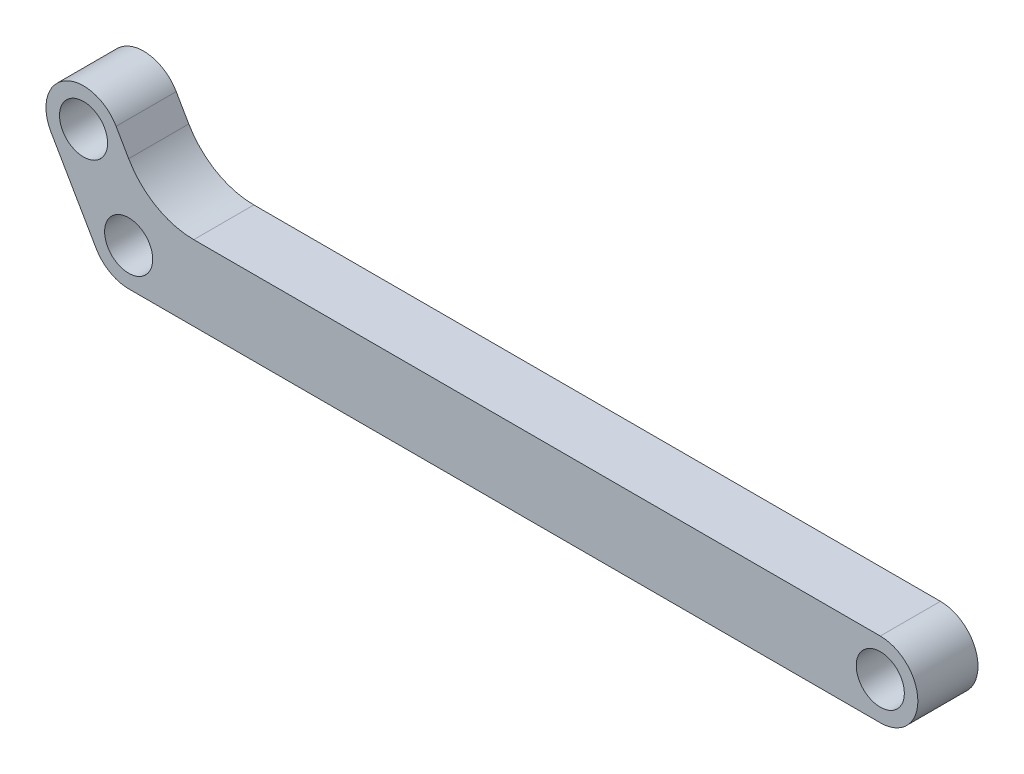
ISO-10303-21;
HEADER;
FILE_DESCRIPTION(('STEP AP214'),'2;1');
FILE_NAME('part.step','',(''),(''),'','','');
FILE_SCHEMA(('AUTOMOTIVE_DESIGN { 1 0 10303 214 1 1 1 1 }'));
ENDSEC;
DATA;
#1=APPLICATION_CONTEXT('core data for automotive mechanical design processes');
#2=APPLICATION_PROTOCOL_DEFINITION('international standard','automotive_design',2000,#1);
#3=PRODUCT_CONTEXT('',#1,'mechanical');
#4=PRODUCT('Part','Part','',(#3));
#5=PRODUCT_RELATED_PRODUCT_CATEGORY('part','',(#4));
#6=PRODUCT_DEFINITION_FORMATION('','',#4);
#7=PRODUCT_DEFINITION_CONTEXT('part definition',#1,'design');
#8=PRODUCT_DEFINITION('design','',#6,#7);
#9=PRODUCT_DEFINITION_SHAPE('','',#8);
#10=(LENGTH_UNIT() NAMED_UNIT(*) SI_UNIT(.MILLI.,.METRE.));
#11=(NAMED_UNIT(*) PLANE_ANGLE_UNIT() SI_UNIT($,.RADIAN.));
#12=(NAMED_UNIT(*) SI_UNIT($,.STERADIAN.) SOLID_ANGLE_UNIT());
#13=UNCERTAINTY_MEASURE_WITH_UNIT(LENGTH_MEASURE(1.E-05),#10,'distance_accuracy_value','');
#14=(GEOMETRIC_REPRESENTATION_CONTEXT(3) GLOBAL_UNCERTAINTY_ASSIGNED_CONTEXT((#13)) GLOBAL_UNIT_ASSIGNED_CONTEXT((#10,
#11,#12)) REPRESENTATION_CONTEXT('',''));
#15=CARTESIAN_POINT('',(0.,0.,0.));
#16=DIRECTION('',(0.,0.,1.));
#17=DIRECTION('',(1.,0.,0.));
#18=AXIS2_PLACEMENT_3D('',#15,#16,#17);
#19=CARTESIAN_POINT('',(4.33012701892217,7.5,4.));
#20=DIRECTION('',(0.,0.,1.));
#21=DIRECTION('',(1.,0.,0.));
#22=AXIS2_PLACEMENT_3D('',#19,#20,#21);
#23=PLANE('',#22);
#24=CARTESIAN_POINT('',(0.,0.,4.));
#25=DIRECTION('',(0.,0.,1.));
#26=DIRECTION('',(1.,0.,0.));
#27=AXIS2_PLACEMENT_3D('',#24,#25,#26);
#28=CIRCLE('',#27,1.6);
#29=CARTESIAN_POINT('',(1.6,0.,4.));
#30=VERTEX_POINT('',#29);
#31=EDGE_CURVE('E182',#30,#30,#28,.T.);
#32=ORIENTED_EDGE('',*,*,#31,.F.);
#33=EDGE_LOOP('',(#32));
#34=FACE_BOUND('',#33,.T.);
#35=CARTESIAN_POINT('',(4.33012701892217,7.5,4.));
#36=DIRECTION('',(0.,0.,-1.));
#37=DIRECTION('',(1.,0.,0.));
#38=AXIS2_PLACEMENT_3D('',#35,#36,#37);
#39=CIRCLE('',#38,5.);
#40=CARTESIAN_POINT('',(4.33012701892217,2.5,4.));
#41=VERTEX_POINT('',#40);
#42=CARTESIAN_POINT('',(0.,4.99999999999998,4.));
#43=VERTEX_POINT('',#42);
#44=EDGE_CURVE('E145',#41,#43,#39,.T.);
#45=ORIENTED_EDGE('',*,*,#44,.T.);
#46=DIRECTION('',(-0.500000000000004,0.866025403784436,0.));
#47=VECTOR('',#46,1.);
#48=CARTESIAN_POINT('',(-0.834936490538935,6.44615242270663,4.));
#49=LINE('',#48,#47);
#50=CARTESIAN_POINT('',(-0.834936490538935,6.44615242270663,4.));
#51=VERTEX_POINT('',#50);
#52=EDGE_CURVE('E93',#43,#51,#49,.T.);
#53=ORIENTED_EDGE('',*,*,#52,.T.);
#54=CARTESIAN_POINT('',(-3.00000000000003,5.19615242270662,4.));
#55=DIRECTION('',(0.,0.,1.));
#56=DIRECTION('',(1.,0.,0.));
#57=AXIS2_PLACEMENT_3D('',#54,#55,#56);
#58=CIRCLE('',#57,2.5);
#59=CARTESIAN_POINT('',(-5.16506350946112,3.94615242270661,4.));
#60=VERTEX_POINT('',#59);
#61=EDGE_CURVE('E160',#51,#60,#58,.T.);
#62=ORIENTED_EDGE('',*,*,#61,.T.);
#63=DIRECTION('',(0.500000000000004,-0.866025403784436,0.));
#64=VECTOR('',#63,1.);
#65=CARTESIAN_POINT('',(-5.16506350946112,3.94615242270661,4.));
#66=LINE('',#65,#64);
#67=CARTESIAN_POINT('',(-2.16506350946109,-1.25000000000001,4.));
#68=VERTEX_POINT('',#67);
#69=EDGE_CURVE('E173',#60,#68,#66,.T.);
#70=ORIENTED_EDGE('',*,*,#69,.T.);
#71=CARTESIAN_POINT('',(0.,0.,4.));
#72=DIRECTION('',(0.,0.,1.));
#73=DIRECTION('',(1.,0.,0.));
#74=AXIS2_PLACEMENT_3D('',#71,#72,#73);
#75=CIRCLE('',#74,2.5);
#76=CARTESIAN_POINT('',(0.,-2.5,4.));
#77=VERTEX_POINT('',#76);
#78=EDGE_CURVE('E112',#68,#77,#75,.T.);
#79=ORIENTED_EDGE('',*,*,#78,.T.);
#80=DIRECTION('',(1.,0.,0.));
#81=VECTOR('',#80,1.);
#82=CARTESIAN_POINT('',(0.,-2.50000000000001,4.));
#83=LINE('',#82,#81);
#84=CARTESIAN_POINT('',(50.,-2.50000000000001,4.));
#85=VERTEX_POINT('',#84);
#86=EDGE_CURVE('E106',#77,#85,#83,.T.);
#87=ORIENTED_EDGE('',*,*,#86,.T.);
#88=CARTESIAN_POINT('',(50.,0.,4.));
#89=DIRECTION('',(0.,0.,1.));
#90=DIRECTION('',(1.,0.,0.));
#91=AXIS2_PLACEMENT_3D('',#88,#89,#90);
#92=CIRCLE('',#91,2.50000000000001);
#93=CARTESIAN_POINT('',(50.,2.50000000000001,4.));
#94=VERTEX_POINT('',#93);
#95=EDGE_CURVE('E110',#85,#94,#92,.T.);
#96=ORIENTED_EDGE('',*,*,#95,.T.);
#97=DIRECTION('',(-1.,0.,0.));
#98=VECTOR('',#97,1.);
#99=CARTESIAN_POINT('',(50.,2.50000000000001,4.));
#100=LINE('',#99,#98);
#101=EDGE_CURVE('E50',#94,#41,#100,.T.);
#102=ORIENTED_EDGE('',*,*,#101,.T.);
#103=EDGE_LOOP('',(#45,#53,#62,#70,#79,#87,#96,#102));
#104=FACE_BOUND('',#103,.T.);
#105=CARTESIAN_POINT('',(-3.00000000000003,5.19615242270662,4.));
#106=DIRECTION('',(0.,0.,1.));
#107=DIRECTION('',(1.,0.,0.));
#108=AXIS2_PLACEMENT_3D('',#105,#106,#107);
#109=CIRCLE('',#108,1.6);
#110=CARTESIAN_POINT('',(-1.40000000000002,5.19615242270662,4.));
#111=VERTEX_POINT('',#110);
#112=EDGE_CURVE('E134',#111,#111,#109,.T.);
#113=ORIENTED_EDGE('',*,*,#112,.F.);
#114=EDGE_LOOP('',(#113));
#115=FACE_BOUND('',#114,.T.);
#116=CARTESIAN_POINT('',(50.,0.,4.));
#117=DIRECTION('',(0.,0.,1.));
#118=DIRECTION('',(1.,0.,0.));
#119=AXIS2_PLACEMENT_3D('',#116,#117,#118);
#120=CIRCLE('',#119,1.60000000000001);
#121=CARTESIAN_POINT('',(51.6,0.,4.));
#122=VERTEX_POINT('',#121);
#123=EDGE_CURVE('E188',#122,#122,#120,.T.);
#124=ORIENTED_EDGE('',*,*,#123,.F.);
#125=EDGE_LOOP('',(#124));
#126=FACE_BOUND('',#125,.T.);
#127=ADVANCED_FACE('F33',(#34,#104,#115,#126),#23,.T.);
#128=CARTESIAN_POINT('',(4.33012701892217,7.5,0.));
#129=DIRECTION('',(0.,0.,1.));
#130=DIRECTION('',(1.,0.,0.));
#131=AXIS2_PLACEMENT_3D('',#128,#129,#130);
#132=PLANE('',#131);
#133=CARTESIAN_POINT('',(4.33012701892217,7.5,0.));
#134=DIRECTION('',(0.,0.,-1.));
#135=DIRECTION('',(1.,0.,0.));
#136=AXIS2_PLACEMENT_3D('',#133,#134,#135);
#137=CIRCLE('',#136,5.);
#138=CARTESIAN_POINT('',(4.33012701892217,2.5,0.));
#139=VERTEX_POINT('',#138);
#140=CARTESIAN_POINT('',(0.,4.99999999999998,0.));
#141=VERTEX_POINT('',#140);
#142=EDGE_CURVE('E130',#139,#141,#137,.T.);
#143=ORIENTED_EDGE('',*,*,#142,.F.);
#144=DIRECTION('',(-1.,0.,0.));
#145=VECTOR('',#144,1.);
#146=CARTESIAN_POINT('',(50.,2.50000000000001,0.));
#147=LINE('',#146,#145);
#148=CARTESIAN_POINT('',(50.,2.50000000000001,0.));
#149=VERTEX_POINT('',#148);
#150=EDGE_CURVE('E85',#149,#139,#147,.T.);
#151=ORIENTED_EDGE('',*,*,#150,.F.);
#152=CARTESIAN_POINT('',(50.,0.,0.));
#153=DIRECTION('',(0.,0.,1.));
#154=DIRECTION('',(1.,0.,0.));
#155=AXIS2_PLACEMENT_3D('',#152,#153,#154);
#156=CIRCLE('',#155,2.50000000000001);
#157=CARTESIAN_POINT('',(50.,-2.50000000000001,0.));
#158=VERTEX_POINT('',#157);
#159=EDGE_CURVE('E79',#158,#149,#156,.T.);
#160=ORIENTED_EDGE('',*,*,#159,.F.);
#161=DIRECTION('',(1.,0.,0.));
#162=VECTOR('',#161,1.);
#163=CARTESIAN_POINT('',(0.,-2.50000000000001,0.));
#164=LINE('',#163,#162);
#165=CARTESIAN_POINT('',(0.,-2.5,0.));
#166=VERTEX_POINT('',#165);
#167=EDGE_CURVE('E120',#166,#158,#164,.T.);
#168=ORIENTED_EDGE('',*,*,#167,.F.);
#169=CARTESIAN_POINT('',(0.,0.,0.));
#170=DIRECTION('',(0.,0.,1.));
#171=DIRECTION('',(1.,0.,0.));
#172=AXIS2_PLACEMENT_3D('',#169,#170,#171);
#173=CIRCLE('',#172,2.5);
#174=CARTESIAN_POINT('',(-2.16506350946109,-1.25000000000001,0.));
#175=VERTEX_POINT('',#174);
#176=EDGE_CURVE('E140',#175,#166,#173,.T.);
#177=ORIENTED_EDGE('',*,*,#176,.F.);
#178=DIRECTION('',(0.500000000000004,-0.866025403784436,0.));
#179=VECTOR('',#178,1.);
#180=CARTESIAN_POINT('',(-5.16506350946112,3.94615242270661,0.));
#181=LINE('',#180,#179);
#182=CARTESIAN_POINT('',(-5.16506350946112,3.94615242270661,0.));
#183=VERTEX_POINT('',#182);
#184=EDGE_CURVE('E138',#183,#175,#181,.T.);
#185=ORIENTED_EDGE('',*,*,#184,.F.);
#186=CARTESIAN_POINT('',(-3.00000000000003,5.19615242270662,0.));
#187=DIRECTION('',(0.,0.,1.));
#188=DIRECTION('',(1.,0.,0.));
#189=AXIS2_PLACEMENT_3D('',#186,#187,#188);
#190=CIRCLE('',#189,2.5);
#191=CARTESIAN_POINT('',(-0.834936490538935,6.44615242270663,0.));
#192=VERTEX_POINT('',#191);
#193=EDGE_CURVE('E136',#192,#183,#190,.T.);
#194=ORIENTED_EDGE('',*,*,#193,.F.);
#195=DIRECTION('',(-0.500000000000004,0.866025403784436,0.));
#196=VECTOR('',#195,1.);
#197=CARTESIAN_POINT('',(-0.834936490538935,6.44615242270663,0.));
#198=LINE('',#197,#196);
#199=EDGE_CURVE('E133',#141,#192,#198,.T.);
#200=ORIENTED_EDGE('',*,*,#199,.F.);
#201=EDGE_LOOP('',(#143,#151,#160,#168,#177,#185,#194,#200));
#202=FACE_BOUND('',#201,.T.);
#203=CARTESIAN_POINT('',(-3.00000000000003,5.19615242270662,0.));
#204=DIRECTION('',(0.,0.,1.));
#205=DIRECTION('',(1.,0.,0.));
#206=AXIS2_PLACEMENT_3D('',#203,#204,#205);
#207=CIRCLE('',#206,1.6);
#208=CARTESIAN_POINT('',(-1.40000000000002,5.19615242270662,0.));
#209=VERTEX_POINT('',#208);
#210=EDGE_CURVE('E179',#209,#209,#207,.T.);
#211=ORIENTED_EDGE('',*,*,#210,.T.);
#212=EDGE_LOOP('',(#211));
#213=FACE_BOUND('',#212,.T.);
#214=CARTESIAN_POINT('',(0.,0.,0.));
#215=DIRECTION('',(0.,0.,1.));
#216=DIRECTION('',(1.,0.,0.));
#217=AXIS2_PLACEMENT_3D('',#214,#215,#216);
#218=CIRCLE('',#217,1.6);
#219=CARTESIAN_POINT('',(1.6,0.,0.));
#220=VERTEX_POINT('',#219);
#221=EDGE_CURVE('E185',#220,#220,#218,.T.);
#222=ORIENTED_EDGE('',*,*,#221,.T.);
#223=EDGE_LOOP('',(#222));
#224=FACE_BOUND('',#223,.T.);
#225=CARTESIAN_POINT('',(50.,0.,0.));
#226=DIRECTION('',(0.,0.,1.));
#227=DIRECTION('',(1.,0.,0.));
#228=AXIS2_PLACEMENT_3D('',#225,#226,#227);
#229=CIRCLE('',#228,1.60000000000001);
#230=CARTESIAN_POINT('',(51.6,0.,0.));
#231=VERTEX_POINT('',#230);
#232=EDGE_CURVE('E191',#231,#231,#229,.T.);
#233=ORIENTED_EDGE('',*,*,#232,.T.);
#234=EDGE_LOOP('',(#233));
#235=FACE_BOUND('',#234,.T.);
#236=ADVANCED_FACE('F164',(#202,#213,#224,#235),#132,.F.);
#237=CARTESIAN_POINT('',(4.33012701892217,7.5,4.));
#238=DIRECTION('',(0.,0.,-1.));
#239=DIRECTION('',(-1.,0.,0.));
#240=AXIS2_PLACEMENT_3D('',#237,#238,#239);
#241=CYLINDRICAL_SURFACE('',#240,5.);
#242=ORIENTED_EDGE('',*,*,#142,.T.);
#243=DIRECTION('',(0.,0.,-1.));
#244=VECTOR('',#243,1.);
#245=CARTESIAN_POINT('',(0.,4.99999999999998,4.));
#246=LINE('',#245,#244);
#247=EDGE_CURVE('E11',#43,#141,#246,.T.);
#248=ORIENTED_EDGE('',*,*,#247,.F.);
#249=ORIENTED_EDGE('',*,*,#44,.F.);
#250=DIRECTION('',(0.,0.,-1.));
#251=VECTOR('',#250,1.);
#252=CARTESIAN_POINT('',(4.33012701892217,2.5,4.));
#253=LINE('',#252,#251);
#254=EDGE_CURVE('E126',#41,#139,#253,.T.);
#255=ORIENTED_EDGE('',*,*,#254,.T.);
#256=EDGE_LOOP('',(#242,#248,#249,#255));
#257=FACE_BOUND('',#256,.T.);
#258=ADVANCED_FACE('F35',(#257),#241,.F.);
#259=CARTESIAN_POINT('',(-0.834936490538935,6.44615242270663,4.));
#260=DIRECTION('',(-0.866025403784436,-0.500000000000004,0.));
#261=DIRECTION('',(0.500000000000004,-0.866025403784436,0.));
#262=AXIS2_PLACEMENT_3D('',#259,#260,#261);
#263=PLANE('',#262);
#264=ORIENTED_EDGE('',*,*,#199,.T.);
#265=DIRECTION('',(0.,0.,-1.));
#266=VECTOR('',#265,1.);
#267=CARTESIAN_POINT('',(-0.834936490538935,6.44615242270663,4.));
#268=LINE('',#267,#266);
#269=EDGE_CURVE('E42',#51,#192,#268,.T.);
#270=ORIENTED_EDGE('',*,*,#269,.F.);
#271=ORIENTED_EDGE('',*,*,#52,.F.);
#272=ORIENTED_EDGE('',*,*,#247,.T.);
#273=EDGE_LOOP('',(#264,#270,#271,#272));
#274=FACE_BOUND('',#273,.T.);
#275=ADVANCED_FACE('F224',(#274),#263,.F.);
#276=CARTESIAN_POINT('',(-3.00000000000003,5.19615242270662,4.));
#277=DIRECTION('',(0.,0.,-1.));
#278=DIRECTION('',(-1.,0.,0.));
#279=AXIS2_PLACEMENT_3D('',#276,#277,#278);
#280=CYLINDRICAL_SURFACE('',#279,2.5);
#281=ORIENTED_EDGE('',*,*,#193,.T.);
#282=DIRECTION('',(0.,0.,-1.));
#283=VECTOR('',#282,1.);
#284=CARTESIAN_POINT('',(-5.16506350946112,3.94615242270661,4.));
#285=LINE('',#284,#283);
#286=EDGE_CURVE('E152',#60,#183,#285,.T.);
#287=ORIENTED_EDGE('',*,*,#286,.F.);
#288=ORIENTED_EDGE('',*,*,#61,.F.);
#289=ORIENTED_EDGE('',*,*,#269,.T.);
#290=EDGE_LOOP('',(#281,#287,#288,#289));
#291=FACE_BOUND('',#290,.T.);
#292=ADVANCED_FACE('F158',(#291),#280,.T.);
#293=CARTESIAN_POINT('',(-5.16506350946112,3.94615242270661,4.));
#294=DIRECTION('',(0.866025403784436,0.500000000000004,0.));
#295=DIRECTION('',(-0.500000000000004,0.866025403784436,0.));
#296=AXIS2_PLACEMENT_3D('',#293,#294,#295);
#297=PLANE('',#296);
#298=ORIENTED_EDGE('',*,*,#184,.T.);
#299=DIRECTION('',(0.,0.,-1.));
#300=VECTOR('',#299,1.);
#301=CARTESIAN_POINT('',(-2.16506350946109,-1.25000000000001,4.));
#302=LINE('',#301,#300);
#303=EDGE_CURVE('E149',#68,#175,#302,.T.);
#304=ORIENTED_EDGE('',*,*,#303,.F.);
#305=ORIENTED_EDGE('',*,*,#69,.F.);
#306=ORIENTED_EDGE('',*,*,#286,.T.);
#307=EDGE_LOOP('',(#298,#304,#305,#306));
#308=FACE_BOUND('',#307,.T.);
#309=ADVANCED_FACE('F169',(#308),#297,.F.);
#310=CARTESIAN_POINT('',(0.,0.,4.));
#311=DIRECTION('',(0.,0.,-1.));
#312=DIRECTION('',(-1.,0.,0.));
#313=AXIS2_PLACEMENT_3D('',#310,#311,#312);
#314=CYLINDRICAL_SURFACE('',#313,2.5);
#315=ORIENTED_EDGE('',*,*,#176,.T.);
#316=DIRECTION('',(0.,0.,-1.));
#317=VECTOR('',#316,1.);
#318=CARTESIAN_POINT('',(0.,-2.5,4.));
#319=LINE('',#318,#317);
#320=EDGE_CURVE('E121',#77,#166,#319,.T.);
#321=ORIENTED_EDGE('',*,*,#320,.F.);
#322=ORIENTED_EDGE('',*,*,#78,.F.);
#323=ORIENTED_EDGE('',*,*,#303,.T.);
#324=EDGE_LOOP('',(#315,#321,#322,#323));
#325=FACE_BOUND('',#324,.T.);
#326=ADVANCED_FACE('F172',(#325),#314,.T.);
#327=CARTESIAN_POINT('',(0.,-2.50000000000001,4.));
#328=DIRECTION('',(0.,1.,0.));
#329=DIRECTION('',(-1.,0.,0.));
#330=AXIS2_PLACEMENT_3D('',#327,#328,#329);
#331=PLANE('',#330);
#332=ORIENTED_EDGE('',*,*,#167,.T.);
#333=DIRECTION('',(0.,0.,-1.));
#334=VECTOR('',#333,1.);
#335=CARTESIAN_POINT('',(50.,-2.50000000000001,4.));
#336=LINE('',#335,#334);
#337=EDGE_CURVE('E117',#85,#158,#336,.T.);
#338=ORIENTED_EDGE('',*,*,#337,.F.);
#339=ORIENTED_EDGE('',*,*,#86,.F.);
#340=ORIENTED_EDGE('',*,*,#320,.T.);
#341=EDGE_LOOP('',(#332,#338,#339,#340));
#342=FACE_BOUND('',#341,.T.);
#343=ADVANCED_FACE('F118',(#342),#331,.F.);
#344=CARTESIAN_POINT('',(50.,0.,4.));
#345=DIRECTION('',(0.,0.,-1.));
#346=DIRECTION('',(-1.,0.,0.));
#347=AXIS2_PLACEMENT_3D('',#344,#345,#346);
#348=CYLINDRICAL_SURFACE('',#347,2.50000000000001);
#349=ORIENTED_EDGE('',*,*,#159,.T.);
#350=DIRECTION('',(0.,0.,-1.));
#351=VECTOR('',#350,1.);
#352=CARTESIAN_POINT('',(50.,2.50000000000001,4.));
#353=LINE('',#352,#351);
#354=EDGE_CURVE('E122',#94,#149,#353,.T.);
#355=ORIENTED_EDGE('',*,*,#354,.F.);
#356=ORIENTED_EDGE('',*,*,#95,.F.);
#357=ORIENTED_EDGE('',*,*,#337,.T.);
#358=EDGE_LOOP('',(#349,#355,#356,#357));
#359=FACE_BOUND('',#358,.T.);
#360=ADVANCED_FACE('F124',(#359),#348,.T.);
#361=CARTESIAN_POINT('',(50.,2.50000000000001,4.));
#362=DIRECTION('',(0.,-1.,0.));
#363=DIRECTION('',(1.,0.,0.));
#364=AXIS2_PLACEMENT_3D('',#361,#362,#363);
#365=PLANE('',#364);
#366=ORIENTED_EDGE('',*,*,#150,.T.);
#367=ORIENTED_EDGE('',*,*,#254,.F.);
#368=ORIENTED_EDGE('',*,*,#101,.F.);
#369=ORIENTED_EDGE('',*,*,#354,.T.);
#370=EDGE_LOOP('',(#366,#367,#368,#369));
#371=FACE_BOUND('',#370,.T.);
#372=ADVANCED_FACE('F212',(#371),#365,.F.);
#373=CARTESIAN_POINT('',(-3.00000000000003,5.19615242270662,4.));
#374=DIRECTION('',(0.,0.,-1.));
#375=DIRECTION('',(-1.,0.,0.));
#376=AXIS2_PLACEMENT_3D('',#373,#374,#375);
#377=CYLINDRICAL_SURFACE('',#376,1.6);
#378=ORIENTED_EDGE('',*,*,#112,.T.);
#379=EDGE_LOOP('',(#378));
#380=FACE_BOUND('',#379,.T.);
#381=ORIENTED_EDGE('',*,*,#210,.F.);
#382=EDGE_LOOP('',(#381));
#383=FACE_BOUND('',#382,.T.);
#384=ADVANCED_FACE('F209',(#380,#383),#377,.F.);
#385=CARTESIAN_POINT('',(0.,0.,4.));
#386=DIRECTION('',(0.,0.,-1.));
#387=DIRECTION('',(-1.,0.,0.));
#388=AXIS2_PLACEMENT_3D('',#385,#386,#387);
#389=CYLINDRICAL_SURFACE('',#388,1.6);
#390=ORIENTED_EDGE('',*,*,#31,.T.);
#391=EDGE_LOOP('',(#390));
#392=FACE_BOUND('',#391,.T.);
#393=ORIENTED_EDGE('',*,*,#221,.F.);
#394=EDGE_LOOP('',(#393));
#395=FACE_BOUND('',#394,.T.);
#396=ADVANCED_FACE('F288',(#392,#395),#389,.F.);
#397=CARTESIAN_POINT('',(50.,0.,4.));
#398=DIRECTION('',(0.,0.,-1.));
#399=DIRECTION('',(-1.,0.,0.));
#400=AXIS2_PLACEMENT_3D('',#397,#398,#399);
#401=CYLINDRICAL_SURFACE('',#400,1.60000000000001);
#402=ORIENTED_EDGE('',*,*,#123,.T.);
#403=EDGE_LOOP('',(#402));
#404=FACE_BOUND('',#403,.T.);
#405=ORIENTED_EDGE('',*,*,#232,.F.);
#406=EDGE_LOOP('',(#405));
#407=FACE_BOUND('',#406,.T.);
#408=ADVANCED_FACE('F197',(#404,#407),#401,.F.);
#409=CLOSED_SHELL('',(#127,#236,#258,#275,#292,#309,#326,#343,#360,#372,#384,#396,#408));
#410=MANIFOLD_SOLID_BREP('B2',#409);
#411=ADVANCED_BREP_SHAPE_REPRESENTATION('',(#18,#410),#14);
#412=SHAPE_DEFINITION_REPRESENTATION(#9,#411);
ENDSEC;
END-ISO-10303-21;
